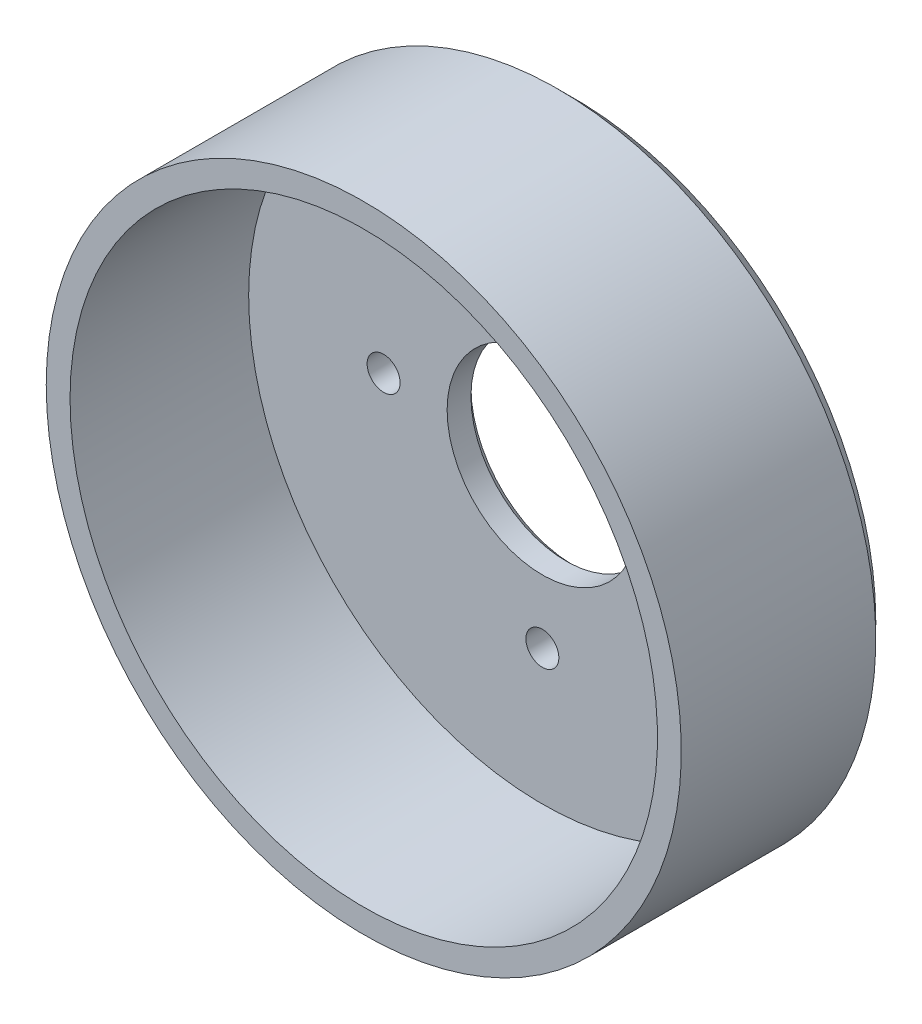
ISO-10303-21;
HEADER;
FILE_DESCRIPTION(('STEP AP214'),'2;1');
FILE_NAME('part.step','',(''),(''),'','','');
FILE_SCHEMA(('AUTOMOTIVE_DESIGN { 1 0 10303 214 1 1 1 1 }'));
ENDSEC;
DATA;
#1=APPLICATION_CONTEXT('core data for automotive mechanical design processes');
#2=APPLICATION_PROTOCOL_DEFINITION('international standard','automotive_design',2000,#1);
#3=PRODUCT_CONTEXT('',#1,'mechanical');
#4=PRODUCT('Part','Part','',(#3));
#5=PRODUCT_RELATED_PRODUCT_CATEGORY('part','',(#4));
#6=PRODUCT_DEFINITION_FORMATION('','',#4);
#7=PRODUCT_DEFINITION_CONTEXT('part definition',#1,'design');
#8=PRODUCT_DEFINITION('design','',#6,#7);
#9=PRODUCT_DEFINITION_SHAPE('','',#8);
#10=(LENGTH_UNIT() NAMED_UNIT(*) SI_UNIT(.MILLI.,.METRE.));
#11=(NAMED_UNIT(*) PLANE_ANGLE_UNIT() SI_UNIT($,.RADIAN.));
#12=(NAMED_UNIT(*) SI_UNIT($,.STERADIAN.) SOLID_ANGLE_UNIT());
#13=UNCERTAINTY_MEASURE_WITH_UNIT(LENGTH_MEASURE(1.E-05),#10,'distance_accuracy_value','');
#14=(GEOMETRIC_REPRESENTATION_CONTEXT(3) GLOBAL_UNCERTAINTY_ASSIGNED_CONTEXT((#13)) GLOBAL_UNIT_ASSIGNED_CONTEXT((#10,
#11,#12)) REPRESENTATION_CONTEXT('',''));
#15=CARTESIAN_POINT('',(0.,0.,0.));
#16=DIRECTION('',(0.,0.,1.));
#17=DIRECTION('',(1.,0.,0.));
#18=AXIS2_PLACEMENT_3D('',#15,#16,#17);
#19=CARTESIAN_POINT('',(0.,0.,13.25));
#20=DIRECTION('',(0.,0.,1.));
#21=DIRECTION('',(1.,0.,0.));
#22=AXIS2_PLACEMENT_3D('',#19,#20,#21);
#23=PLANE('',#22);
#24=CARTESIAN_POINT('',(0.,0.,13.25));
#25=DIRECTION('',(0.,0.,-1.));
#26=DIRECTION('',(1.,0.,0.));
#27=AXIS2_PLACEMENT_3D('',#24,#25,#26);
#28=CIRCLE('',#27,18.5);
#29=CARTESIAN_POINT('',(-18.5,0.,13.25));
#30=VERTEX_POINT('',#29);
#31=EDGE_CURVE('E27',#30,#30,#28,.T.);
#32=ORIENTED_EDGE('',*,*,#31,.T.);
#33=EDGE_LOOP('',(#32));
#34=FACE_BOUND('',#33,.T.);
#35=CARTESIAN_POINT('',(0.,0.,13.25));
#36=DIRECTION('',(0.,0.,1.));
#37=DIRECTION('',(1.,0.,0.));
#38=AXIS2_PLACEMENT_3D('',#35,#36,#37);
#39=CIRCLE('',#38,20.);
#40=CARTESIAN_POINT('',(-20.,0.,13.25));
#41=VERTEX_POINT('',#40);
#42=EDGE_CURVE('E120',#41,#41,#39,.T.);
#43=ORIENTED_EDGE('',*,*,#42,.T.);
#44=EDGE_LOOP('',(#43));
#45=FACE_BOUND('',#44,.T.);
#46=ADVANCED_FACE('F17',(#34,#45),#23,.T.);
#47=CARTESIAN_POINT('',(0.,0.,0.));
#48=DIRECTION('',(0.,0.,1.));
#49=DIRECTION('',(1.,0.,0.));
#50=AXIS2_PLACEMENT_3D('',#47,#48,#49);
#51=CYLINDRICAL_SURFACE('',#50,18.5);
#52=ORIENTED_EDGE('',*,*,#31,.F.);
#53=DIRECTION('',(0.,0.,-1.));
#54=VECTOR('',#53,1.);
#55=CARTESIAN_POINT('',(-18.5,0.,0.));
#56=LINE('',#55,#54);
#57=CARTESIAN_POINT('',(-18.5,0.,2.));
#58=VERTEX_POINT('',#57);
#59=EDGE_CURVE('E11',#30,#58,#56,.T.);
#60=ORIENTED_EDGE('',*,*,#59,.T.);
#61=CARTESIAN_POINT('',(0.,0.,2.));
#62=DIRECTION('',(0.,0.,-1.));
#63=DIRECTION('',(1.,0.,0.));
#64=AXIS2_PLACEMENT_3D('',#61,#62,#63);
#65=CIRCLE('',#64,18.5);
#66=EDGE_CURVE('E138',#58,#58,#65,.T.);
#67=ORIENTED_EDGE('',*,*,#66,.T.);
#68=ORIENTED_EDGE('',*,*,#59,.F.);
#69=EDGE_LOOP('',(#52,#60,#67,#68));
#70=FACE_BOUND('',#69,.T.);
#71=ADVANCED_FACE('F19',(#70),#51,.F.);
#72=CARTESIAN_POINT('',(0.,0.,2.));
#73=DIRECTION('',(0.,0.,1.));
#74=DIRECTION('',(1.,0.,0.));
#75=AXIS2_PLACEMENT_3D('',#72,#73,#74);
#76=PLANE('',#75);
#77=CARTESIAN_POINT('',(0.,0.,2.));
#78=DIRECTION('',(0.,0.,-1.));
#79=DIRECTION('',(1.,0.,0.));
#80=AXIS2_PLACEMENT_3D('',#77,#78,#79);
#81=CIRCLE('',#80,6.);
#82=CARTESIAN_POINT('',(-6.,0.,2.));
#83=VERTEX_POINT('',#82);
#84=EDGE_CURVE('E135',#83,#83,#81,.T.);
#85=ORIENTED_EDGE('',*,*,#84,.T.);
#86=EDGE_LOOP('',(#85));
#87=FACE_BOUND('',#86,.T.);
#88=CARTESIAN_POINT('',(-10.,0.,2.));
#89=DIRECTION('',(0.,0.,-1.));
#90=DIRECTION('',(1.,0.,0.));
#91=AXIS2_PLACEMENT_3D('',#88,#89,#90);
#92=CIRCLE('',#91,1.03775);
#93=CARTESIAN_POINT('',(-11.03775,0.,2.));
#94=VERTEX_POINT('',#93);
#95=EDGE_CURVE('E93',#94,#94,#92,.T.);
#96=ORIENTED_EDGE('',*,*,#95,.T.);
#97=EDGE_LOOP('',(#96));
#98=FACE_BOUND('',#97,.T.);
#99=CARTESIAN_POINT('',(0.,10.,2.));
#100=DIRECTION('',(0.,0.,-1.));
#101=DIRECTION('',(1.,0.,0.));
#102=AXIS2_PLACEMENT_3D('',#99,#100,#101);
#103=CIRCLE('',#102,1.03775);
#104=CARTESIAN_POINT('',(-1.03775,10.,2.));
#105=VERTEX_POINT('',#104);
#106=EDGE_CURVE('E232',#105,#105,#103,.T.);
#107=ORIENTED_EDGE('',*,*,#106,.T.);
#108=EDGE_LOOP('',(#107));
#109=FACE_BOUND('',#108,.T.);
#110=CARTESIAN_POINT('',(0.,-10.,2.));
#111=DIRECTION('',(0.,0.,-1.));
#112=DIRECTION('',(1.,0.,0.));
#113=AXIS2_PLACEMENT_3D('',#110,#111,#112);
#114=CIRCLE('',#113,1.03775);
#115=CARTESIAN_POINT('',(-1.03775,-10.,2.));
#116=VERTEX_POINT('',#115);
#117=EDGE_CURVE('E227',#116,#116,#114,.T.);
#118=ORIENTED_EDGE('',*,*,#117,.T.);
#119=EDGE_LOOP('',(#118));
#120=FACE_BOUND('',#119,.T.);
#121=CARTESIAN_POINT('',(10.,0.,2.));
#122=DIRECTION('',(0.,0.,-1.));
#123=DIRECTION('',(1.,0.,0.));
#124=AXIS2_PLACEMENT_3D('',#121,#122,#123);
#125=CIRCLE('',#124,1.03775);
#126=CARTESIAN_POINT('',(8.96225,0.,2.));
#127=VERTEX_POINT('',#126);
#128=EDGE_CURVE('E219',#127,#127,#125,.T.);
#129=ORIENTED_EDGE('',*,*,#128,.T.);
#130=EDGE_LOOP('',(#129));
#131=FACE_BOUND('',#130,.T.);
#132=ORIENTED_EDGE('',*,*,#66,.F.);
#133=EDGE_LOOP('',(#132));
#134=FACE_BOUND('',#133,.T.);
#135=ADVANCED_FACE('F95',(#87,#98,#109,#120,#131,#134),#76,.T.);
#136=CARTESIAN_POINT('',(0.,0.,0.));
#137=DIRECTION('',(0.,0.,1.));
#138=DIRECTION('',(1.,0.,0.));
#139=AXIS2_PLACEMENT_3D('',#136,#137,#138);
#140=CYLINDRICAL_SURFACE('',#139,6.);
#141=ORIENTED_EDGE('',*,*,#84,.F.);
#142=DIRECTION('',(0.,0.,-1.));
#143=VECTOR('',#142,1.);
#144=CARTESIAN_POINT('',(-6.,0.,0.));
#145=LINE('',#144,#143);
#146=CARTESIAN_POINT('',(-6.,0.,0.5));
#147=VERTEX_POINT('',#146);
#148=EDGE_CURVE('E57',#83,#147,#145,.T.);
#149=ORIENTED_EDGE('',*,*,#148,.T.);
#150=CARTESIAN_POINT('',(0.,0.,0.5));
#151=DIRECTION('',(0.,0.,1.));
#152=DIRECTION('',(1.,0.,0.));
#153=AXIS2_PLACEMENT_3D('',#150,#151,#152);
#154=CIRCLE('',#153,6.);
#155=EDGE_CURVE('E123',#147,#147,#154,.T.);
#156=ORIENTED_EDGE('',*,*,#155,.F.);
#157=ORIENTED_EDGE('',*,*,#148,.F.);
#158=EDGE_LOOP('',(#141,#149,#156,#157));
#159=FACE_BOUND('',#158,.T.);
#160=ADVANCED_FACE('F151',(#159),#140,.F.);
#161=CARTESIAN_POINT('',(0.,0.,0.25));
#162=DIRECTION('',(0.,0.,-1.));
#163=DIRECTION('',(1.,0.,0.));
#164=AXIS2_PLACEMENT_3D('',#161,#162,#163);
#165=CONICAL_SURFACE('',#164,6.25,0.785398163397449);
#166=ORIENTED_EDGE('',*,*,#155,.T.);
#167=DIRECTION('',(-0.707106781186548,0.,-0.707106781186547));
#168=VECTOR('',#167,1.);
#169=CARTESIAN_POINT('',(-6.25,0.,0.25));
#170=LINE('',#169,#168);
#171=CARTESIAN_POINT('',(-6.5,0.,0.));
#172=VERTEX_POINT('',#171);
#173=EDGE_CURVE('E127',#147,#172,#170,.T.);
#174=ORIENTED_EDGE('',*,*,#173,.T.);
#175=CARTESIAN_POINT('',(0.,0.,0.));
#176=DIRECTION('',(0.,0.,-1.));
#177=DIRECTION('',(1.,0.,0.));
#178=AXIS2_PLACEMENT_3D('',#175,#176,#177);
#179=CIRCLE('',#178,6.5);
#180=EDGE_CURVE('E116',#172,#172,#179,.T.);
#181=ORIENTED_EDGE('',*,*,#180,.T.);
#182=ORIENTED_EDGE('',*,*,#173,.F.);
#183=EDGE_LOOP('',(#166,#174,#181,#182));
#184=FACE_BOUND('',#183,.T.);
#185=ADVANCED_FACE('F177',(#184),#165,.F.);
#186=CARTESIAN_POINT('',(0.,0.,0.));
#187=DIRECTION('',(0.,0.,1.));
#188=DIRECTION('',(1.,0.,0.));
#189=AXIS2_PLACEMENT_3D('',#186,#187,#188);
#190=CYLINDRICAL_SURFACE('',#189,20.);
#191=ORIENTED_EDGE('',*,*,#42,.F.);
#192=DIRECTION('',(0.,0.,-1.));
#193=VECTOR('',#192,1.);
#194=CARTESIAN_POINT('',(-20.,0.,0.));
#195=LINE('',#194,#193);
#196=CARTESIAN_POINT('',(-20.,0.,1.));
#197=VERTEX_POINT('',#196);
#198=EDGE_CURVE('E69',#41,#197,#195,.T.);
#199=ORIENTED_EDGE('',*,*,#198,.T.);
#200=CARTESIAN_POINT('',(0.,0.,1.));
#201=DIRECTION('',(0.,0.,-1.));
#202=DIRECTION('',(1.,0.,0.));
#203=AXIS2_PLACEMENT_3D('',#200,#201,#202);
#204=CIRCLE('',#203,20.);
#205=EDGE_CURVE('E100',#197,#197,#204,.T.);
#206=ORIENTED_EDGE('',*,*,#205,.F.);
#207=ORIENTED_EDGE('',*,*,#198,.F.);
#208=EDGE_LOOP('',(#191,#199,#206,#207));
#209=FACE_BOUND('',#208,.T.);
#210=ADVANCED_FACE('F176',(#209),#190,.T.);
#211=CARTESIAN_POINT('',(0.,0.,0.));
#212=DIRECTION('',(0.,0.,1.));
#213=DIRECTION('',(1.,0.,0.));
#214=AXIS2_PLACEMENT_3D('',#211,#212,#213);
#215=PLANE('',#214);
#216=ORIENTED_EDGE('',*,*,#180,.F.);
#217=EDGE_LOOP('',(#216));
#218=FACE_BOUND('',#217,.T.);
#219=CARTESIAN_POINT('',(-10.,0.,0.));
#220=DIRECTION('',(0.,0.,1.));
#221=DIRECTION('',(1.,0.,0.));
#222=AXIS2_PLACEMENT_3D('',#219,#220,#221);
#223=CIRCLE('',#222,1.03775);
#224=CARTESIAN_POINT('',(-11.03775,0.,0.));
#225=VERTEX_POINT('',#224);
#226=EDGE_CURVE('E107',#225,#225,#223,.T.);
#227=ORIENTED_EDGE('',*,*,#226,.T.);
#228=EDGE_LOOP('',(#227));
#229=FACE_BOUND('',#228,.T.);
#230=CARTESIAN_POINT('',(0.,10.,0.));
#231=DIRECTION('',(0.,0.,1.));
#232=DIRECTION('',(1.,0.,0.));
#233=AXIS2_PLACEMENT_3D('',#230,#231,#232);
#234=CIRCLE('',#233,1.03775);
#235=CARTESIAN_POINT('',(-1.03775,10.,0.));
#236=VERTEX_POINT('',#235);
#237=EDGE_CURVE('E198',#236,#236,#234,.T.);
#238=ORIENTED_EDGE('',*,*,#237,.T.);
#239=EDGE_LOOP('',(#238));
#240=FACE_BOUND('',#239,.T.);
#241=CARTESIAN_POINT('',(0.,-10.,0.));
#242=DIRECTION('',(0.,0.,1.));
#243=DIRECTION('',(1.,0.,0.));
#244=AXIS2_PLACEMENT_3D('',#241,#242,#243);
#245=CIRCLE('',#244,1.03775);
#246=CARTESIAN_POINT('',(-1.03775,-10.,0.));
#247=VERTEX_POINT('',#246);
#248=EDGE_CURVE('E203',#247,#247,#245,.T.);
#249=ORIENTED_EDGE('',*,*,#248,.T.);
#250=EDGE_LOOP('',(#249));
#251=FACE_BOUND('',#250,.T.);
#252=CARTESIAN_POINT('',(10.,0.,0.));
#253=DIRECTION('',(0.,0.,1.));
#254=DIRECTION('',(1.,0.,0.));
#255=AXIS2_PLACEMENT_3D('',#252,#253,#254);
#256=CIRCLE('',#255,1.03775);
#257=CARTESIAN_POINT('',(8.96225,0.,0.));
#258=VERTEX_POINT('',#257);
#259=EDGE_CURVE('E206',#258,#258,#256,.T.);
#260=ORIENTED_EDGE('',*,*,#259,.T.);
#261=EDGE_LOOP('',(#260));
#262=FACE_BOUND('',#261,.T.);
#263=CARTESIAN_POINT('',(0.,0.,0.));
#264=DIRECTION('',(0.,0.,1.));
#265=DIRECTION('',(1.,0.,0.));
#266=AXIS2_PLACEMENT_3D('',#263,#264,#265);
#267=CIRCLE('',#266,19.);
#268=CARTESIAN_POINT('',(-19.,0.,0.));
#269=VERTEX_POINT('',#268);
#270=EDGE_CURVE('E115',#269,#269,#267,.T.);
#271=ORIENTED_EDGE('',*,*,#270,.F.);
#272=EDGE_LOOP('',(#271));
#273=FACE_BOUND('',#272,.T.);
#274=ADVANCED_FACE('F173',(#218,#229,#240,#251,#262,#273),#215,.F.);
#275=CARTESIAN_POINT('',(0.,0.,0.5));
#276=DIRECTION('',(0.,0.,1.));
#277=DIRECTION('',(1.,0.,0.));
#278=AXIS2_PLACEMENT_3D('',#275,#276,#277);
#279=CONICAL_SURFACE('',#278,19.5,0.785398163397449);
#280=ORIENTED_EDGE('',*,*,#205,.T.);
#281=DIRECTION('',(0.707106781186548,0.,-0.707106781186547));
#282=VECTOR('',#281,1.);
#283=CARTESIAN_POINT('',(-19.5,0.,0.5));
#284=LINE('',#283,#282);
#285=EDGE_CURVE('E106',#197,#269,#284,.T.);
#286=ORIENTED_EDGE('',*,*,#285,.T.);
#287=ORIENTED_EDGE('',*,*,#270,.T.);
#288=ORIENTED_EDGE('',*,*,#285,.F.);
#289=EDGE_LOOP('',(#280,#286,#287,#288));
#290=FACE_BOUND('',#289,.T.);
#291=ADVANCED_FACE('F169',(#290),#279,.T.);
#292=CARTESIAN_POINT('',(-10.,0.,0.));
#293=DIRECTION('',(0.,0.,1.));
#294=DIRECTION('',(1.,0.,0.));
#295=AXIS2_PLACEMENT_3D('',#292,#293,#294);
#296=CYLINDRICAL_SURFACE('',#295,1.03775);
#297=ORIENTED_EDGE('',*,*,#226,.F.);
#298=DIRECTION('',(0.,0.,1.));
#299=VECTOR('',#298,1.);
#300=CARTESIAN_POINT('',(-11.03775,0.,0.));
#301=LINE('',#300,#299);
#302=EDGE_CURVE('E98',#225,#94,#301,.T.);
#303=ORIENTED_EDGE('',*,*,#302,.T.);
#304=ORIENTED_EDGE('',*,*,#95,.F.);
#305=ORIENTED_EDGE('',*,*,#302,.F.);
#306=EDGE_LOOP('',(#297,#303,#304,#305));
#307=FACE_BOUND('',#306,.T.);
#308=ADVANCED_FACE('F164',(#307),#296,.F.);
#309=CARTESIAN_POINT('',(0.,10.,0.));
#310=DIRECTION('',(0.,0.,1.));
#311=DIRECTION('',(1.,0.,0.));
#312=AXIS2_PLACEMENT_3D('',#309,#310,#311);
#313=CYLINDRICAL_SURFACE('',#312,1.03775);
#314=ORIENTED_EDGE('',*,*,#237,.F.);
#315=DIRECTION('',(0.,0.,1.));
#316=VECTOR('',#315,1.);
#317=CARTESIAN_POINT('',(-1.03775,10.,0.));
#318=LINE('',#317,#316);
#319=EDGE_CURVE('E226',#236,#105,#318,.T.);
#320=ORIENTED_EDGE('',*,*,#319,.T.);
#321=ORIENTED_EDGE('',*,*,#106,.F.);
#322=ORIENTED_EDGE('',*,*,#319,.F.);
#323=EDGE_LOOP('',(#314,#320,#321,#322));
#324=FACE_BOUND('',#323,.T.);
#325=ADVANCED_FACE('F162',(#324),#313,.F.);
#326=CARTESIAN_POINT('',(0.,-10.,0.));
#327=DIRECTION('',(0.,0.,1.));
#328=DIRECTION('',(1.,0.,0.));
#329=AXIS2_PLACEMENT_3D('',#326,#327,#328);
#330=CYLINDRICAL_SURFACE('',#329,1.03775);
#331=ORIENTED_EDGE('',*,*,#248,.F.);
#332=DIRECTION('',(0.,0.,1.));
#333=VECTOR('',#332,1.);
#334=CARTESIAN_POINT('',(-1.03775,-10.,0.));
#335=LINE('',#334,#333);
#336=EDGE_CURVE('E230',#247,#116,#335,.T.);
#337=ORIENTED_EDGE('',*,*,#336,.T.);
#338=ORIENTED_EDGE('',*,*,#117,.F.);
#339=ORIENTED_EDGE('',*,*,#336,.F.);
#340=EDGE_LOOP('',(#331,#337,#338,#339));
#341=FACE_BOUND('',#340,.T.);
#342=ADVANCED_FACE('F159',(#341),#330,.F.);
#343=CARTESIAN_POINT('',(10.,0.,0.));
#344=DIRECTION('',(0.,0.,1.));
#345=DIRECTION('',(1.,0.,0.));
#346=AXIS2_PLACEMENT_3D('',#343,#344,#345);
#347=CYLINDRICAL_SURFACE('',#346,1.03775);
#348=ORIENTED_EDGE('',*,*,#259,.F.);
#349=DIRECTION('',(0.,0.,1.));
#350=VECTOR('',#349,1.);
#351=CARTESIAN_POINT('',(8.96225,0.,0.));
#352=LINE('',#351,#350);
#353=EDGE_CURVE('E217',#258,#127,#352,.T.);
#354=ORIENTED_EDGE('',*,*,#353,.T.);
#355=ORIENTED_EDGE('',*,*,#128,.F.);
#356=ORIENTED_EDGE('',*,*,#353,.F.);
#357=EDGE_LOOP('',(#348,#354,#355,#356));
#358=FACE_BOUND('',#357,.T.);
#359=ADVANCED_FACE('F158',(#358),#347,.F.);
#360=CLOSED_SHELL('',(#46,#71,#135,#160,#185,#210,#274,#291,#308,#325,#342,#359));
#361=MANIFOLD_SOLID_BREP('B1',#360);
#362=ADVANCED_BREP_SHAPE_REPRESENTATION('',(#18,#361),#14);
#363=SHAPE_DEFINITION_REPRESENTATION(#9,#362);
ENDSEC;
END-ISO-10303-21;
